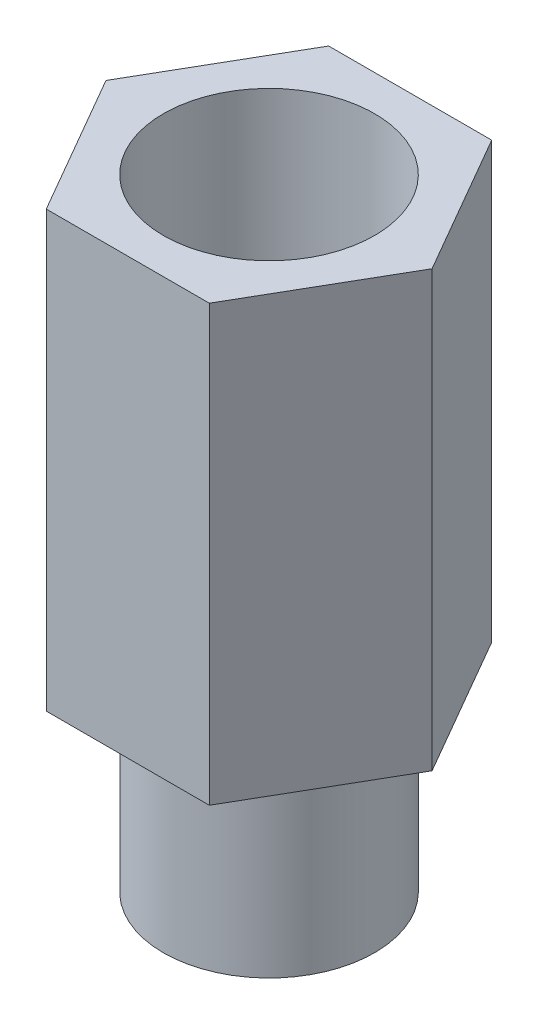
ISO-10303-21;
HEADER;
FILE_DESCRIPTION(('STEP AP214'),'2;1');
FILE_NAME('part.step','',(''),(''),'','','');
FILE_SCHEMA(('AUTOMOTIVE_DESIGN { 1 0 10303 214 1 1 1 1 }'));
ENDSEC;
DATA;
#1=APPLICATION_CONTEXT('core data for automotive mechanical design processes');
#2=APPLICATION_PROTOCOL_DEFINITION('international standard','automotive_design',2000,#1);
#3=PRODUCT_CONTEXT('',#1,'mechanical');
#4=PRODUCT('Part','Part','',(#3));
#5=PRODUCT_RELATED_PRODUCT_CATEGORY('part','',(#4));
#6=PRODUCT_DEFINITION_FORMATION('','',#4);
#7=PRODUCT_DEFINITION_CONTEXT('part definition',#1,'design');
#8=PRODUCT_DEFINITION('design','',#6,#7);
#9=PRODUCT_DEFINITION_SHAPE('','',#8);
#10=(LENGTH_UNIT() NAMED_UNIT(*) SI_UNIT(.MILLI.,.METRE.));
#11=(NAMED_UNIT(*) PLANE_ANGLE_UNIT() SI_UNIT($,.RADIAN.));
#12=(NAMED_UNIT(*) SI_UNIT($,.STERADIAN.) SOLID_ANGLE_UNIT());
#13=UNCERTAINTY_MEASURE_WITH_UNIT(LENGTH_MEASURE(1.E-05),#10,'distance_accuracy_value','');
#14=(GEOMETRIC_REPRESENTATION_CONTEXT(3) GLOBAL_UNCERTAINTY_ASSIGNED_CONTEXT((#13)) GLOBAL_UNIT_ASSIGNED_CONTEXT((#10,
#11,#12)) REPRESENTATION_CONTEXT('',''));
#15=CARTESIAN_POINT('',(0.,0.,0.));
#16=DIRECTION('',(0.,0.,1.));
#17=DIRECTION('',(1.,0.,0.));
#18=AXIS2_PLACEMENT_3D('',#15,#16,#17);
#19=CARTESIAN_POINT('',(1.31249999999999,7.,-2.27331668493415));
#20=DIRECTION('',(-0.866025403784438,0.,0.500000000000001));
#21=DIRECTION('',(0.500000000000001,0.,0.866025403784438));
#22=AXIS2_PLACEMENT_3D('',#19,#20,#21);
#23=PLANE('',#22);
#24=DIRECTION('',(-0.500000000000001,0.,-0.866025403784438));
#25=VECTOR('',#24,1.);
#26=CARTESIAN_POINT('',(1.31249999999999,0.,-2.27331668493415));
#27=LINE('',#26,#25);
#28=CARTESIAN_POINT('',(2.625,0.,0.));
#29=VERTEX_POINT('',#28);
#30=CARTESIAN_POINT('',(1.31249999999999,0.,-2.27331668493415));
#31=VERTEX_POINT('',#30);
#32=EDGE_CURVE('E120',#29,#31,#27,.T.);
#33=ORIENTED_EDGE('',*,*,#32,.T.);
#34=DIRECTION('',(0.,-1.,0.));
#35=VECTOR('',#34,1.);
#36=CARTESIAN_POINT('',(1.31249999999999,7.,-2.27331668493415));
#37=LINE('',#36,#35);
#38=CARTESIAN_POINT('',(1.31249999999999,7.,-2.27331668493415));
#39=VERTEX_POINT('',#38);
#40=EDGE_CURVE('E11',#39,#31,#37,.T.);
#41=ORIENTED_EDGE('',*,*,#40,.F.);
#42=DIRECTION('',(-0.500000000000001,0.,-0.866025403784438));
#43=VECTOR('',#42,1.);
#44=CARTESIAN_POINT('',(1.31249999999999,7.,-2.27331668493415));
#45=LINE('',#44,#43);
#46=CARTESIAN_POINT('',(2.625,7.,0.));
#47=VERTEX_POINT('',#46);
#48=EDGE_CURVE('E131',#47,#39,#45,.T.);
#49=ORIENTED_EDGE('',*,*,#48,.F.);
#50=DIRECTION('',(0.,-1.,0.));
#51=VECTOR('',#50,1.);
#52=CARTESIAN_POINT('',(2.625,7.,0.));
#53=LINE('',#52,#51);
#54=EDGE_CURVE('E116',#47,#29,#53,.T.);
#55=ORIENTED_EDGE('',*,*,#54,.T.);
#56=EDGE_LOOP('',(#33,#41,#49,#55));
#57=FACE_BOUND('',#56,.T.);
#58=ADVANCED_FACE('F36',(#57),#23,.F.);
#59=CARTESIAN_POINT('',(1.31249999999999,7.,-2.27331668493415));
#60=DIRECTION('',(0.,0.,1.));
#61=DIRECTION('',(1.,0.,0.));
#62=AXIS2_PLACEMENT_3D('',#59,#60,#61);
#63=PLANE('',#62);
#64=DIRECTION('',(-1.,0.,0.));
#65=VECTOR('',#64,1.);
#66=CARTESIAN_POINT('',(1.31249999999999,0.,-2.27331668493415));
#67=LINE('',#66,#65);
#68=CARTESIAN_POINT('',(-1.3125,0.,-2.27331668493415));
#69=VERTEX_POINT('',#68);
#70=EDGE_CURVE('E123',#31,#69,#67,.T.);
#71=ORIENTED_EDGE('',*,*,#70,.T.);
#72=DIRECTION('',(0.,-1.,0.));
#73=VECTOR('',#72,1.);
#74=CARTESIAN_POINT('',(-1.3125,7.,-2.27331668493415));
#75=LINE('',#74,#73);
#76=CARTESIAN_POINT('',(-1.3125,7.,-2.27331668493415));
#77=VERTEX_POINT('',#76);
#78=EDGE_CURVE('E44',#77,#69,#75,.T.);
#79=ORIENTED_EDGE('',*,*,#78,.F.);
#80=DIRECTION('',(-1.,0.,0.));
#81=VECTOR('',#80,1.);
#82=CARTESIAN_POINT('',(1.31249999999999,7.,-2.27331668493415));
#83=LINE('',#82,#81);
#84=EDGE_CURVE('E89',#39,#77,#83,.T.);
#85=ORIENTED_EDGE('',*,*,#84,.F.);
#86=ORIENTED_EDGE('',*,*,#40,.T.);
#87=EDGE_LOOP('',(#71,#79,#85,#86));
#88=FACE_BOUND('',#87,.T.);
#89=ADVANCED_FACE('F156',(#88),#63,.F.);
#90=CARTESIAN_POINT('',(-1.3125,7.,-2.27331668493415));
#91=DIRECTION('',(0.866025403784439,0.,0.5));
#92=DIRECTION('',(0.5,0.,-0.866025403784439));
#93=AXIS2_PLACEMENT_3D('',#90,#91,#92);
#94=PLANE('',#93);
#95=DIRECTION('',(-0.5,0.,0.866025403784439));
#96=VECTOR('',#95,1.);
#97=CARTESIAN_POINT('',(-1.3125,0.,-2.27331668493415));
#98=LINE('',#97,#96);
#99=CARTESIAN_POINT('',(-2.625,0.,0.));
#100=VERTEX_POINT('',#99);
#101=EDGE_CURVE('E126',#69,#100,#98,.T.);
#102=ORIENTED_EDGE('',*,*,#101,.T.);
#103=DIRECTION('',(0.,-1.,0.));
#104=VECTOR('',#103,1.);
#105=CARTESIAN_POINT('',(-2.625,7.,0.));
#106=LINE('',#105,#104);
#107=CARTESIAN_POINT('',(-2.625,7.,0.));
#108=VERTEX_POINT('',#107);
#109=EDGE_CURVE('E111',#108,#100,#106,.T.);
#110=ORIENTED_EDGE('',*,*,#109,.F.);
#111=DIRECTION('',(-0.5,0.,0.866025403784439));
#112=VECTOR('',#111,1.);
#113=CARTESIAN_POINT('',(-1.3125,7.,-2.27331668493415));
#114=LINE('',#113,#112);
#115=EDGE_CURVE('E102',#77,#108,#114,.T.);
#116=ORIENTED_EDGE('',*,*,#115,.F.);
#117=ORIENTED_EDGE('',*,*,#78,.T.);
#118=EDGE_LOOP('',(#102,#110,#116,#117));
#119=FACE_BOUND('',#118,.T.);
#120=ADVANCED_FACE('F137',(#119),#94,.F.);
#121=CARTESIAN_POINT('',(-1.3125,7.,2.27331668493415));
#122=DIRECTION('',(0.866025403784438,0.,-0.5));
#123=DIRECTION('',(-0.5,0.,-0.866025403784439));
#124=AXIS2_PLACEMENT_3D('',#121,#122,#123);
#125=PLANE('',#124);
#126=DIRECTION('',(0.5,0.,0.866025403784439));
#127=VECTOR('',#126,1.);
#128=CARTESIAN_POINT('',(-1.3125,0.,2.27331668493415));
#129=LINE('',#128,#127);
#130=CARTESIAN_POINT('',(-1.3125,0.,2.27331668493415));
#131=VERTEX_POINT('',#130);
#132=EDGE_CURVE('E110',#100,#131,#129,.T.);
#133=ORIENTED_EDGE('',*,*,#132,.T.);
#134=DIRECTION('',(0.,-1.,0.));
#135=VECTOR('',#134,1.);
#136=CARTESIAN_POINT('',(-1.3125,7.,2.27331668493415));
#137=LINE('',#136,#135);
#138=CARTESIAN_POINT('',(-1.3125,7.,2.27331668493415));
#139=VERTEX_POINT('',#138);
#140=EDGE_CURVE('E107',#139,#131,#137,.T.);
#141=ORIENTED_EDGE('',*,*,#140,.F.);
#142=DIRECTION('',(0.5,0.,0.866025403784439));
#143=VECTOR('',#142,1.);
#144=CARTESIAN_POINT('',(-1.3125,7.,2.27331668493415));
#145=LINE('',#144,#143);
#146=EDGE_CURVE('E96',#108,#139,#145,.T.);
#147=ORIENTED_EDGE('',*,*,#146,.F.);
#148=ORIENTED_EDGE('',*,*,#109,.T.);
#149=EDGE_LOOP('',(#133,#141,#147,#148));
#150=FACE_BOUND('',#149,.T.);
#151=ADVANCED_FACE('F108',(#150),#125,.F.);
#152=CARTESIAN_POINT('',(1.31249999999999,7.,2.27331668493415));
#153=DIRECTION('',(0.,0.,-1.));
#154=DIRECTION('',(-1.,0.,0.));
#155=AXIS2_PLACEMENT_3D('',#152,#153,#154);
#156=PLANE('',#155);
#157=DIRECTION('',(1.,0.,0.));
#158=VECTOR('',#157,1.);
#159=CARTESIAN_POINT('',(1.31249999999999,0.,2.27331668493415));
#160=LINE('',#159,#158);
#161=CARTESIAN_POINT('',(1.31249999999999,0.,2.27331668493415));
#162=VERTEX_POINT('',#161);
#163=EDGE_CURVE('E75',#131,#162,#160,.T.);
#164=ORIENTED_EDGE('',*,*,#163,.T.);
#165=DIRECTION('',(0.,-1.,0.));
#166=VECTOR('',#165,1.);
#167=CARTESIAN_POINT('',(1.31249999999999,7.,2.27331668493415));
#168=LINE('',#167,#166);
#169=CARTESIAN_POINT('',(1.31249999999999,7.,2.27331668493415));
#170=VERTEX_POINT('',#169);
#171=EDGE_CURVE('E112',#170,#162,#168,.T.);
#172=ORIENTED_EDGE('',*,*,#171,.F.);
#173=DIRECTION('',(1.,0.,0.));
#174=VECTOR('',#173,1.);
#175=CARTESIAN_POINT('',(1.31249999999999,7.,2.27331668493415));
#176=LINE('',#175,#174);
#177=EDGE_CURVE('E100',#139,#170,#176,.T.);
#178=ORIENTED_EDGE('',*,*,#177,.F.);
#179=ORIENTED_EDGE('',*,*,#140,.T.);
#180=EDGE_LOOP('',(#164,#172,#178,#179));
#181=FACE_BOUND('',#180,.T.);
#182=ADVANCED_FACE('F114',(#181),#156,.F.);
#183=CARTESIAN_POINT('',(1.31249999999999,7.,2.27331668493415));
#184=DIRECTION('',(-0.866025403784438,0.,-0.500000000000001));
#185=DIRECTION('',(-0.500000000000001,0.,0.866025403784438));
#186=AXIS2_PLACEMENT_3D('',#183,#184,#185);
#187=PLANE('',#186);
#188=DIRECTION('',(0.500000000000001,0.,-0.866025403784438));
#189=VECTOR('',#188,1.);
#190=CARTESIAN_POINT('',(1.31249999999999,0.,2.27331668493415));
#191=LINE('',#190,#189);
#192=EDGE_CURVE('E81',#162,#29,#191,.T.);
#193=ORIENTED_EDGE('',*,*,#192,.T.);
#194=ORIENTED_EDGE('',*,*,#54,.F.);
#195=DIRECTION('',(0.500000000000001,0.,-0.866025403784438));
#196=VECTOR('',#195,1.);
#197=CARTESIAN_POINT('',(1.31249999999999,7.,2.27331668493415));
#198=LINE('',#197,#196);
#199=EDGE_CURVE('E52',#170,#47,#198,.T.);
#200=ORIENTED_EDGE('',*,*,#199,.F.);
#201=ORIENTED_EDGE('',*,*,#171,.T.);
#202=EDGE_LOOP('',(#193,#194,#200,#201));
#203=FACE_BOUND('',#202,.T.);
#204=ADVANCED_FACE('F144',(#203),#187,.F.);
#205=CARTESIAN_POINT('',(0.,7.,0.));
#206=DIRECTION('',(0.,1.,0.));
#207=DIRECTION('',(0.,0.,1.));
#208=AXIS2_PLACEMENT_3D('',#205,#206,#207);
#209=PLANE('',#208);
#210=CARTESIAN_POINT('',(0.,7.,0.));
#211=DIRECTION('',(0.,1.,0.));
#212=DIRECTION('',(0.,0.,1.));
#213=AXIS2_PLACEMENT_3D('',#210,#211,#212);
#214=CIRCLE('',#213,1.7);
#215=CARTESIAN_POINT('',(0.,7.,1.7));
#216=VERTEX_POINT('',#215);
#217=EDGE_CURVE('E240',#216,#216,#214,.T.);
#218=ORIENTED_EDGE('',*,*,#217,.F.);
#219=EDGE_LOOP('',(#218));
#220=FACE_BOUND('',#219,.T.);
#221=ORIENTED_EDGE('',*,*,#48,.T.);
#222=ORIENTED_EDGE('',*,*,#84,.T.);
#223=ORIENTED_EDGE('',*,*,#115,.T.);
#224=ORIENTED_EDGE('',*,*,#146,.T.);
#225=ORIENTED_EDGE('',*,*,#177,.T.);
#226=ORIENTED_EDGE('',*,*,#199,.T.);
#227=EDGE_LOOP('',(#221,#222,#223,#224,#225,#226));
#228=FACE_BOUND('',#227,.T.);
#229=ADVANCED_FACE('F98',(#220,#228),#209,.T.);
#230=CARTESIAN_POINT('',(0.,0.,0.));
#231=DIRECTION('',(0.,1.,0.));
#232=DIRECTION('',(0.,0.,1.));
#233=AXIS2_PLACEMENT_3D('',#230,#231,#232);
#234=PLANE('',#233);
#235=CARTESIAN_POINT('',(0.,0.,0.));
#236=DIRECTION('',(0.,1.,0.));
#237=DIRECTION('',(0.,0.,1.));
#238=AXIS2_PLACEMENT_3D('',#235,#236,#237);
#239=CIRCLE('',#238,1.7);
#240=CARTESIAN_POINT('',(0.,0.,1.7));
#241=VERTEX_POINT('',#240);
#242=EDGE_CURVE('E239',#241,#241,#239,.T.);
#243=ORIENTED_EDGE('',*,*,#242,.T.);
#244=EDGE_LOOP('',(#243));
#245=FACE_BOUND('',#244,.T.);
#246=ORIENTED_EDGE('',*,*,#32,.F.);
#247=ORIENTED_EDGE('',*,*,#192,.F.);
#248=ORIENTED_EDGE('',*,*,#163,.F.);
#249=ORIENTED_EDGE('',*,*,#132,.F.);
#250=ORIENTED_EDGE('',*,*,#101,.F.);
#251=ORIENTED_EDGE('',*,*,#70,.F.);
#252=EDGE_LOOP('',(#246,#247,#248,#249,#250,#251));
#253=FACE_BOUND('',#252,.T.);
#254=ADVANCED_FACE('F140',(#245,#253),#234,.F.);
#255=CARTESIAN_POINT('',(0.,-3.,0.));
#256=DIRECTION('',(0.,1.,0.));
#257=DIRECTION('',(0.,0.,1.));
#258=AXIS2_PLACEMENT_3D('',#255,#256,#257);
#259=CYLINDRICAL_SURFACE('',#258,1.7);
#260=CARTESIAN_POINT('',(0.,-3.,0.));
#261=DIRECTION('',(0.,1.,0.));
#262=DIRECTION('',(0.,0.,1.));
#263=AXIS2_PLACEMENT_3D('',#260,#261,#262);
#264=CIRCLE('',#263,1.7);
#265=CARTESIAN_POINT('',(0.,-3.,1.7));
#266=VERTEX_POINT('',#265);
#267=EDGE_CURVE('E124',#266,#266,#264,.T.);
#268=ORIENTED_EDGE('',*,*,#267,.T.);
#269=EDGE_LOOP('',(#268));
#270=FACE_BOUND('',#269,.T.);
#271=ORIENTED_EDGE('',*,*,#242,.F.);
#272=EDGE_LOOP('',(#271));
#273=FACE_BOUND('',#272,.T.);
#274=ADVANCED_FACE('F188',(#270,#273),#259,.T.);
#275=CARTESIAN_POINT('',(0.,-3.,0.));
#276=DIRECTION('',(0.,1.,0.));
#277=DIRECTION('',(0.,0.,1.));
#278=AXIS2_PLACEMENT_3D('',#275,#276,#277);
#279=PLANE('',#278);
#280=ORIENTED_EDGE('',*,*,#267,.F.);
#281=EDGE_LOOP('',(#280));
#282=FACE_BOUND('',#281,.T.);
#283=ADVANCED_FACE('F197',(#282),#279,.F.);
#284=CARTESIAN_POINT('',(0.,3.,0.));
#285=DIRECTION('',(0.,1.,0.));
#286=DIRECTION('',(0.,0.,1.));
#287=AXIS2_PLACEMENT_3D('',#284,#285,#286);
#288=CYLINDRICAL_SURFACE('',#287,1.7);
#289=CARTESIAN_POINT('',(0.,3.,0.));
#290=DIRECTION('',(0.,1.,0.));
#291=DIRECTION('',(0.,0.,1.));
#292=AXIS2_PLACEMENT_3D('',#289,#290,#291);
#293=CIRCLE('',#292,1.7);
#294=CARTESIAN_POINT('',(0.,3.,1.7));
#295=VERTEX_POINT('',#294);
#296=EDGE_CURVE('E238',#295,#295,#293,.T.);
#297=ORIENTED_EDGE('',*,*,#296,.F.);
#298=EDGE_LOOP('',(#297));
#299=FACE_BOUND('',#298,.T.);
#300=ORIENTED_EDGE('',*,*,#217,.T.);
#301=EDGE_LOOP('',(#300));
#302=FACE_BOUND('',#301,.T.);
#303=ADVANCED_FACE('F207',(#299,#302),#288,.F.);
#304=CARTESIAN_POINT('',(0.,3.,0.));
#305=DIRECTION('',(0.,1.,0.));
#306=DIRECTION('',(0.,0.,1.));
#307=AXIS2_PLACEMENT_3D('',#304,#305,#306);
#308=PLANE('',#307);
#309=ORIENTED_EDGE('',*,*,#296,.T.);
#310=EDGE_LOOP('',(#309));
#311=FACE_BOUND('',#310,.T.);
#312=ADVANCED_FACE('F222',(#311),#308,.T.);
#313=CLOSED_SHELL('',(#58,#89,#120,#151,#182,#204,#229,#254,#274,#283,#303,#312));
#314=MANIFOLD_SOLID_BREP('B2',#313);
#315=ADVANCED_BREP_SHAPE_REPRESENTATION('',(#18,#314),#14);
#316=SHAPE_DEFINITION_REPRESENTATION(#9,#315);
ENDSEC;
END-ISO-10303-21;
